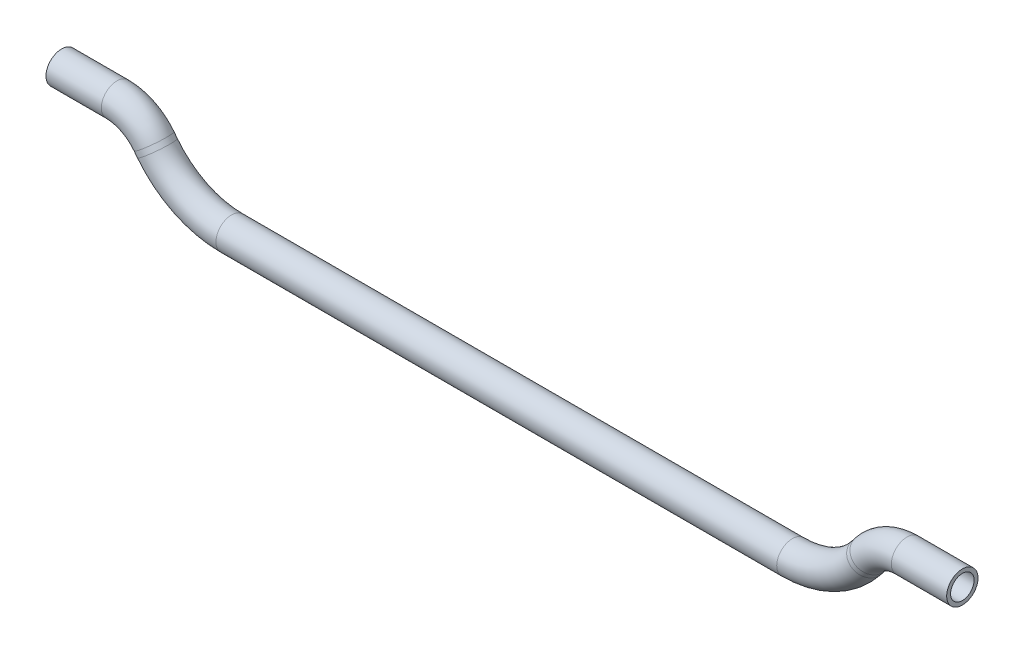
ISO-10303-21;
HEADER;
FILE_DESCRIPTION(('STEP AP214'),'2;1');
FILE_NAME('part.step','',(''),(''),'','','');
FILE_SCHEMA(('AUTOMOTIVE_DESIGN { 1 0 10303 214 1 1 1 1 }'));
ENDSEC;
DATA;
#1=APPLICATION_CONTEXT('core data for automotive mechanical design processes');
#2=APPLICATION_PROTOCOL_DEFINITION('international standard','automotive_design',2000,#1);
#3=PRODUCT_CONTEXT('',#1,'mechanical');
#4=PRODUCT('Part','Part','',(#3));
#5=PRODUCT_RELATED_PRODUCT_CATEGORY('part','',(#4));
#6=PRODUCT_DEFINITION_FORMATION('','',#4);
#7=PRODUCT_DEFINITION_CONTEXT('part definition',#1,'design');
#8=PRODUCT_DEFINITION('design','',#6,#7);
#9=PRODUCT_DEFINITION_SHAPE('','',#8);
#10=(LENGTH_UNIT() NAMED_UNIT(*) SI_UNIT(.MILLI.,.METRE.));
#11=(NAMED_UNIT(*) PLANE_ANGLE_UNIT() SI_UNIT($,.RADIAN.));
#12=(NAMED_UNIT(*) SI_UNIT($,.STERADIAN.) SOLID_ANGLE_UNIT());
#13=UNCERTAINTY_MEASURE_WITH_UNIT(LENGTH_MEASURE(1.E-05),#10,'distance_accuracy_value','');
#14=(GEOMETRIC_REPRESENTATION_CONTEXT(3) GLOBAL_UNCERTAINTY_ASSIGNED_CONTEXT((#13)) GLOBAL_UNIT_ASSIGNED_CONTEXT((#10,
#11,#12)) REPRESENTATION_CONTEXT('',''));
#15=CARTESIAN_POINT('',(0.,0.,0.));
#16=DIRECTION('',(0.,0.,1.));
#17=DIRECTION('',(1.,0.,0.));
#18=AXIS2_PLACEMENT_3D('',#15,#16,#17);
#19=CARTESIAN_POINT('',(1079.36394984699,1.11022302462516E-13,0.));
#20=DIRECTION('',(1.,0.,0.));
#21=DIRECTION('',(0.,1.,0.));
#22=AXIS2_PLACEMENT_3D('',#19,#20,#21);
#23=CYLINDRICAL_SURFACE('',#22,20.);
#24=CARTESIAN_POINT('',(1079.36394984699,1.11022302462516E-13,0.));
#25=DIRECTION('',(1.,0.,0.));
#26=DIRECTION('',(0.,0.,-1.));
#27=AXIS2_PLACEMENT_3D('',#24,#25,#26);
#28=CIRCLE('',#27,20.);
#29=CARTESIAN_POINT('',(1079.36394984699,20.0000000000001,0.));
#30=VERTEX_POINT('',#29);
#31=EDGE_CURVE('E43',#30,#30,#28,.T.);
#32=CARTESIAN_POINT('',(1150.,0.,0.));
#33=DIRECTION('',(1.,0.,0.));
#34=DIRECTION('',(0.,0.,-1.));
#35=AXIS2_PLACEMENT_3D('',#32,#33,#34);
#36=CIRCLE('',#35,20.);
#37=CARTESIAN_POINT('',(1150.,20.0000000000001,0.));
#38=VERTEX_POINT('',#37);
#39=EDGE_CURVE('E10',#38,#38,#36,.T.);
#40=CARTESIAN_POINT('',(1079.36394984699,20.0000000000001,0.));
#41=CARTESIAN_POINT('',(1080.09974203608,20.0000000000001,0.));
#42=CARTESIAN_POINT('',(1080.83553422518,20.0000000000001,0.));
#43=CARTESIAN_POINT('',(1082.30711860336,20.0000000000001,0.));
#44=CARTESIAN_POINT('',(1083.04291079246,20.0000000000001,0.));
#45=CARTESIAN_POINT('',(1084.51449517065,20.0000000000001,0.));
#46=CARTESIAN_POINT('',(1085.25028735974,20.0000000000001,0.));
#47=CARTESIAN_POINT('',(1086.72187173793,20.0000000000001,0.));
#48=CARTESIAN_POINT('',(1087.45766392702,20.0000000000001,0.));
#49=CARTESIAN_POINT('',(1088.92924830521,20.0000000000001,0.));
#50=CARTESIAN_POINT('',(1089.6650404943,20.0000000000001,0.));
#51=CARTESIAN_POINT('',(1091.13662487249,20.0000000000001,0.));
#52=CARTESIAN_POINT('',(1091.87241706158,20.0000000000001,0.));
#53=CARTESIAN_POINT('',(1093.34400143977,20.0000000000001,0.));
#54=CARTESIAN_POINT('',(1094.07979362887,20.0000000000001,0.));
#55=CARTESIAN_POINT('',(1095.55137800705,20.0000000000001,0.));
#56=CARTESIAN_POINT('',(1096.28717019615,20.0000000000001,0.));
#57=CARTESIAN_POINT('',(1097.75875457433,20.0000000000001,0.));
#58=CARTESIAN_POINT('',(1098.49454676343,20.0000000000001,0.));
#59=CARTESIAN_POINT('',(1099.96613114162,20.0000000000001,0.));
#60=CARTESIAN_POINT('',(1100.70192333071,20.0000000000001,0.));
#61=CARTESIAN_POINT('',(1102.1735077089,20.0000000000001,0.));
#62=CARTESIAN_POINT('',(1102.90929989799,20.0000000000001,0.));
#63=CARTESIAN_POINT('',(1104.38088427618,20.0000000000001,0.));
#64=CARTESIAN_POINT('',(1105.11667646527,20.0000000000001,0.));
#65=CARTESIAN_POINT('',(1106.58826084346,20.0000000000001,0.));
#66=CARTESIAN_POINT('',(1107.32405303256,20.0000000000001,0.));
#67=CARTESIAN_POINT('',(1108.79563741074,20.0000000000001,0.));
#68=CARTESIAN_POINT('',(1109.53142959984,20.0000000000001,0.));
#69=CARTESIAN_POINT('',(1111.00301397802,20.0000000000001,0.));
#70=CARTESIAN_POINT('',(1111.73880616712,20.0000000000001,0.));
#71=CARTESIAN_POINT('',(1113.21039054531,20.0000000000001,0.));
#72=CARTESIAN_POINT('',(1113.9461827344,20.0000000000001,0.));
#73=CARTESIAN_POINT('',(1115.41776711259,20.0000000000001,0.));
#74=CARTESIAN_POINT('',(1116.15355930168,20.0000000000001,0.));
#75=CARTESIAN_POINT('',(1117.62514367987,20.0000000000001,0.));
#76=CARTESIAN_POINT('',(1118.36093586896,20.0000000000001,0.));
#77=CARTESIAN_POINT('',(1119.83252024715,20.0000000000001,0.));
#78=CARTESIAN_POINT('',(1120.56831243625,20.0000000000001,0.));
#79=CARTESIAN_POINT('',(1122.03989681443,20.0000000000001,0.));
#80=CARTESIAN_POINT('',(1122.77568900353,20.0000000000001,0.));
#81=CARTESIAN_POINT('',(1124.24727338171,20.0000000000001,0.));
#82=CARTESIAN_POINT('',(1124.98306557081,20.0000000000001,0.));
#83=CARTESIAN_POINT('',(1126.454649949,20.0000000000001,0.));
#84=CARTESIAN_POINT('',(1127.19044213809,20.0000000000001,0.));
#85=CARTESIAN_POINT('',(1128.66202651628,20.0000000000001,0.));
#86=CARTESIAN_POINT('',(1129.39781870537,20.0000000000001,0.));
#87=CARTESIAN_POINT('',(1130.86940308356,20.0000000000001,0.));
#88=CARTESIAN_POINT('',(1131.60519527265,20.0000000000001,0.));
#89=CARTESIAN_POINT('',(1133.07677965084,20.0000000000001,0.));
#90=CARTESIAN_POINT('',(1133.81257183993,20.0000000000001,0.));
#91=CARTESIAN_POINT('',(1135.28415621812,20.0000000000001,0.));
#92=CARTESIAN_POINT('',(1136.01994840722,20.0000000000001,0.));
#93=CARTESIAN_POINT('',(1137.4915327854,20.0000000000001,0.));
#94=CARTESIAN_POINT('',(1138.2273249745,20.0000000000001,0.));
#95=CARTESIAN_POINT('',(1139.69890935269,20.0000000000001,0.));
#96=CARTESIAN_POINT('',(1140.43470154178,20.0000000000001,0.));
#97=CARTESIAN_POINT('',(1141.90628591997,20.0000000000001,0.));
#98=CARTESIAN_POINT('',(1142.64207810906,20.0000000000001,0.));
#99=CARTESIAN_POINT('',(1144.11366248725,20.0000000000001,0.));
#100=CARTESIAN_POINT('',(1144.84945467634,20.0000000000001,0.));
#101=CARTESIAN_POINT('',(1146.32103905453,20.0000000000001,0.));
#102=CARTESIAN_POINT('',(1147.05683124362,20.0000000000001,0.));
#103=CARTESIAN_POINT('',(1148.52841562181,20.0000000000001,0.));
#104=CARTESIAN_POINT('',(1149.26420781091,20.0000000000001,0.));
#105=CARTESIAN_POINT('',(1150.,20.0000000000001,0.));
#106=B_SPLINE_CURVE_WITH_KNOTS('',3,(#40,#41,#42,#43,#44,#45,#46,#47,#48,#49,#50,#51,#52,#53,
#54,#55,#56,#57,#58,#59,#60,#61,#62,#63,#64,#65,#66,#67,#68,#69,#70,#71,#72,#73,#74,#75,#76,#77,
#78,#79,#80,#81,#82,#83,#84,#85,#86,#87,#88,#89,#90,#91,#92,#93,#94,#95,#96,#97,#98,#99,#100,
#101,#102,#103,#104,#105),.UNSPECIFIED.,.F.,.F.,(4,2,2,2,2,2,2,2,2,2,2,2,2,2,2,2,2,2,2,2,2,2,2,
2,2,2,2,2,2,2,2,2,4),(0.,2.20737656728143,4.41475313456308,6.62212970184473,8.82950626912637,
11.036882836408,13.2442594036897,15.4516359709713,17.659012538253,19.8663891055344,
22.073765672816,24.2811422400977,26.4885188073793,28.695895374661,30.9032719419426,
33.1106485092243,35.3180250765059,37.5254016437874,39.732778211069,41.9401547783507,
44.1475313456323,46.354907912914,48.5622844801956,50.7696610474773,52.9770376147589,
55.1844141820403,57.391790749322,59.5991673166036,61.8065438838853,64.0139204511669,
66.2212970184486,68.4286735857302,70.6360501530119),.UNSPECIFIED.);
#107=EDGE_CURVE('BSEAM33',#30,#38,#106,.T.);
#108=ORIENTED_EDGE('',*,*,#31,.T.);
#109=ORIENTED_EDGE('',*,*,#39,.F.);
#110=ORIENTED_EDGE('',*,*,#107,.T.);
#111=ORIENTED_EDGE('',*,*,#107,.F.);
#112=EDGE_LOOP('',(#108,#110,#109,#111));
#113=FACE_BOUND('',#112,.T.);
#114=ADVANCED_FACE('F33',(#113),#23,.T.);
#115=CARTESIAN_POINT('',(1079.36394984699,1.11022302462516E-13,0.));
#116=DIRECTION('',(1.,0.,0.));
#117=DIRECTION('',(0.,1.,0.));
#118=AXIS2_PLACEMENT_3D('',#115,#116,#117);
#119=CYLINDRICAL_SURFACE('',#118,15.);
#120=CARTESIAN_POINT('',(1079.36394984699,1.11022302462516E-13,0.));
#121=DIRECTION('',(1.,0.,0.));
#122=DIRECTION('',(0.,0.,-1.));
#123=AXIS2_PLACEMENT_3D('',#120,#121,#122);
#124=CIRCLE('',#123,15.);
#125=CARTESIAN_POINT('',(1079.36394984699,15.0000000000001,0.));
#126=VERTEX_POINT('',#125);
#127=EDGE_CURVE('E47',#126,#126,#124,.T.);
#128=CARTESIAN_POINT('',(1150.,0.,0.));
#129=DIRECTION('',(1.,0.,0.));
#130=DIRECTION('',(0.,0.,-1.));
#131=AXIS2_PLACEMENT_3D('',#128,#129,#130);
#132=CIRCLE('',#131,15.);
#133=CARTESIAN_POINT('',(1150.,15.0000000000001,0.));
#134=VERTEX_POINT('',#133);
#135=EDGE_CURVE('E39',#134,#134,#132,.T.);
#136=CARTESIAN_POINT('',(1079.36394984699,15.0000000000001,0.));
#137=CARTESIAN_POINT('',(1080.09974203608,15.0000000000001,0.));
#138=CARTESIAN_POINT('',(1080.83553422518,15.0000000000001,0.));
#139=CARTESIAN_POINT('',(1082.30711860336,15.0000000000001,0.));
#140=CARTESIAN_POINT('',(1083.04291079246,15.0000000000001,0.));
#141=CARTESIAN_POINT('',(1084.51449517065,15.0000000000001,0.));
#142=CARTESIAN_POINT('',(1085.25028735974,15.0000000000001,0.));
#143=CARTESIAN_POINT('',(1086.72187173793,15.0000000000001,0.));
#144=CARTESIAN_POINT('',(1087.45766392702,15.0000000000001,0.));
#145=CARTESIAN_POINT('',(1088.92924830521,15.0000000000001,0.));
#146=CARTESIAN_POINT('',(1089.6650404943,15.0000000000001,0.));
#147=CARTESIAN_POINT('',(1091.13662487249,15.0000000000001,0.));
#148=CARTESIAN_POINT('',(1091.87241706158,15.0000000000001,0.));
#149=CARTESIAN_POINT('',(1093.34400143977,15.0000000000001,0.));
#150=CARTESIAN_POINT('',(1094.07979362887,15.0000000000001,0.));
#151=CARTESIAN_POINT('',(1095.55137800705,15.0000000000001,0.));
#152=CARTESIAN_POINT('',(1096.28717019615,15.0000000000001,0.));
#153=CARTESIAN_POINT('',(1097.75875457433,15.0000000000001,0.));
#154=CARTESIAN_POINT('',(1098.49454676343,15.0000000000001,0.));
#155=CARTESIAN_POINT('',(1099.96613114162,15.0000000000001,0.));
#156=CARTESIAN_POINT('',(1100.70192333071,15.0000000000001,0.));
#157=CARTESIAN_POINT('',(1102.1735077089,15.0000000000001,0.));
#158=CARTESIAN_POINT('',(1102.90929989799,15.0000000000001,0.));
#159=CARTESIAN_POINT('',(1104.38088427618,15.0000000000001,0.));
#160=CARTESIAN_POINT('',(1105.11667646527,15.0000000000001,0.));
#161=CARTESIAN_POINT('',(1106.58826084346,15.0000000000001,0.));
#162=CARTESIAN_POINT('',(1107.32405303256,15.0000000000001,0.));
#163=CARTESIAN_POINT('',(1108.79563741074,15.0000000000001,0.));
#164=CARTESIAN_POINT('',(1109.53142959984,15.0000000000001,0.));
#165=CARTESIAN_POINT('',(1111.00301397802,15.0000000000001,0.));
#166=CARTESIAN_POINT('',(1111.73880616712,15.0000000000001,0.));
#167=CARTESIAN_POINT('',(1113.21039054531,15.0000000000001,0.));
#168=CARTESIAN_POINT('',(1113.9461827344,15.0000000000001,0.));
#169=CARTESIAN_POINT('',(1115.41776711259,15.0000000000001,0.));
#170=CARTESIAN_POINT('',(1116.15355930168,15.0000000000001,0.));
#171=CARTESIAN_POINT('',(1117.62514367987,15.0000000000001,0.));
#172=CARTESIAN_POINT('',(1118.36093586896,15.0000000000001,0.));
#173=CARTESIAN_POINT('',(1119.83252024715,15.0000000000001,0.));
#174=CARTESIAN_POINT('',(1120.56831243625,15.0000000000001,0.));
#175=CARTESIAN_POINT('',(1122.03989681443,15.0000000000001,0.));
#176=CARTESIAN_POINT('',(1122.77568900353,15.0000000000001,0.));
#177=CARTESIAN_POINT('',(1124.24727338171,15.0000000000001,0.));
#178=CARTESIAN_POINT('',(1124.98306557081,15.0000000000001,0.));
#179=CARTESIAN_POINT('',(1126.454649949,15.0000000000001,0.));
#180=CARTESIAN_POINT('',(1127.19044213809,15.0000000000001,0.));
#181=CARTESIAN_POINT('',(1128.66202651628,15.0000000000001,0.));
#182=CARTESIAN_POINT('',(1129.39781870537,15.0000000000001,0.));
#183=CARTESIAN_POINT('',(1130.86940308356,15.0000000000001,0.));
#184=CARTESIAN_POINT('',(1131.60519527265,15.0000000000001,0.));
#185=CARTESIAN_POINT('',(1133.07677965084,15.0000000000001,0.));
#186=CARTESIAN_POINT('',(1133.81257183993,15.0000000000001,0.));
#187=CARTESIAN_POINT('',(1135.28415621812,15.0000000000001,0.));
#188=CARTESIAN_POINT('',(1136.01994840722,15.0000000000001,0.));
#189=CARTESIAN_POINT('',(1137.4915327854,15.0000000000001,0.));
#190=CARTESIAN_POINT('',(1138.2273249745,15.0000000000001,0.));
#191=CARTESIAN_POINT('',(1139.69890935269,15.0000000000001,0.));
#192=CARTESIAN_POINT('',(1140.43470154178,15.0000000000001,0.));
#193=CARTESIAN_POINT('',(1141.90628591997,15.0000000000001,0.));
#194=CARTESIAN_POINT('',(1142.64207810906,15.0000000000001,0.));
#195=CARTESIAN_POINT('',(1144.11366248725,15.0000000000001,0.));
#196=CARTESIAN_POINT('',(1144.84945467634,15.0000000000001,0.));
#197=CARTESIAN_POINT('',(1146.32103905453,15.0000000000001,0.));
#198=CARTESIAN_POINT('',(1147.05683124362,15.0000000000001,0.));
#199=CARTESIAN_POINT('',(1148.52841562181,15.0000000000001,0.));
#200=CARTESIAN_POINT('',(1149.26420781091,15.0000000000001,0.));
#201=CARTESIAN_POINT('',(1150.,15.0000000000001,0.));
#202=B_SPLINE_CURVE_WITH_KNOTS('',3,(#136,#137,#138,#139,#140,#141,#142,#143,#144,#145,#146,
#147,#148,#149,#150,#151,#152,#153,#154,#155,#156,#157,#158,#159,#160,#161,#162,#163,#164,#165,
#166,#167,#168,#169,#170,#171,#172,#173,#174,#175,#176,#177,#178,#179,#180,#181,#182,#183,#184,
#185,#186,#187,#188,#189,#190,#191,#192,#193,#194,#195,#196,#197,#198,#199,#200,#201),
.UNSPECIFIED.,.F.,.F.,(4,2,2,2,2,2,2,2,2,2,2,2,2,2,2,2,2,2,2,2,2,2,2,2,2,2,2,2,2,2,2,2,4),(0.,
2.20737656728165,4.4147531345633,6.62212970184495,8.8295062691266,11.0368828364082,
13.2442594036899,15.4516359709715,17.6590125382532,19.8663891055346,22.0737656728163,
24.2811422400979,26.4885188073796,28.6958953746612,30.9032719419429,33.1106485092245,
35.3180250765062,37.5254016437876,39.7327782110692,41.9401547783509,44.1475313456325,
46.3549079129142,48.5622844801958,50.7696610474775,52.9770376147591,55.1844141820406,
57.3917907493222,59.5991673166039,61.8065438838855,64.0139204511672,66.2212970184488,
68.4286735857305,70.6360501530121),.UNSPECIFIED.);
#203=EDGE_CURVE('BSEAM153',#126,#134,#202,.T.);
#204=ORIENTED_EDGE('',*,*,#127,.F.);
#205=ORIENTED_EDGE('',*,*,#135,.T.);
#206=ORIENTED_EDGE('',*,*,#203,.T.);
#207=ORIENTED_EDGE('',*,*,#203,.F.);
#208=EDGE_LOOP('',(#204,#206,#205,#207));
#209=FACE_BOUND('',#208,.T.);
#210=ADVANCED_FACE('F153',(#209),#119,.F.);
#211=CARTESIAN_POINT('',(1079.36394984699,-60.,0.));
#212=DIRECTION('',(0.,0.,-1.));
#213=DIRECTION('',(-1.,0.,0.));
#214=AXIS2_PLACEMENT_3D('',#211,#212,#213);
#215=TOROIDAL_SURFACE('',#214,60.0000000000001,20.);
#216=CARTESIAN_POINT('',(1031.9840766375,-23.1876703446674,0.));
#217=DIRECTION('',(0.613538827588876,0.78966455349146,0.));
#218=DIRECTION('',(0.,0.,-1.));
#219=AXIS2_PLACEMENT_3D('',#216,#217,#218);
#220=CIRCLE('',#219,20.);
#221=CARTESIAN_POINT('',(1016.19078556767,-10.9168937928899,0.));
#222=VERTEX_POINT('',#221);
#223=EDGE_CURVE('E52',#222,#222,#220,.T.);
#224=CARTESIAN_POINT('',(1079.36394984699,-60.,0.));
#225=DIRECTION('',(0.,0.,-1.));
#226=DIRECTION('',(-1.,0.,0.));
#227=AXIS2_PLACEMENT_3D('',#224,#225,#226);
#228=CIRCLE('',#227,80.0000000000001);
#229=EDGE_CURVE('',#222,#30,#228,.T.);
#230=ORIENTED_EDGE('',*,*,#223,.T.);
#231=ORIENTED_EDGE('',*,*,#31,.F.);
#232=ORIENTED_EDGE('',*,*,#229,.T.);
#233=ORIENTED_EDGE('',*,*,#229,.F.);
#234=EDGE_LOOP('',(#230,#232,#231,#233));
#235=FACE_BOUND('',#234,.T.);
#236=ADVANCED_FACE('F149',(#235),#215,.T.);
#237=CARTESIAN_POINT('',(1079.36394984699,-60.,0.));
#238=DIRECTION('',(0.,0.,-1.));
#239=DIRECTION('',(-1.,0.,0.));
#240=AXIS2_PLACEMENT_3D('',#237,#238,#239);
#241=TOROIDAL_SURFACE('',#240,60.0000000000001,15.);
#242=CARTESIAN_POINT('',(1031.9840766375,-23.1876703446674,0.));
#243=DIRECTION('',(0.613538827588876,0.78966455349146,0.));
#244=DIRECTION('',(0.,0.,-1.));
#245=AXIS2_PLACEMENT_3D('',#242,#243,#244);
#246=CIRCLE('',#245,15.);
#247=CARTESIAN_POINT('',(1020.13910833513,-13.9845879308342,0.));
#248=VERTEX_POINT('',#247);
#249=EDGE_CURVE('E55',#248,#248,#246,.T.);
#250=CARTESIAN_POINT('',(1079.36394984699,-60.,0.));
#251=DIRECTION('',(0.,0.,-1.));
#252=DIRECTION('',(-1.,0.,0.));
#253=AXIS2_PLACEMENT_3D('',#250,#251,#252);
#254=CIRCLE('',#253,75.0000000000001);
#255=EDGE_CURVE('',#248,#126,#254,.T.);
#256=ORIENTED_EDGE('',*,*,#249,.F.);
#257=ORIENTED_EDGE('',*,*,#127,.T.);
#258=ORIENTED_EDGE('',*,*,#255,.T.);
#259=ORIENTED_EDGE('',*,*,#255,.F.);
#260=EDGE_LOOP('',(#256,#258,#257,#259));
#261=FACE_BOUND('',#260,.T.);
#262=ADVANCED_FACE('F146',(#261),#241,.F.);
#263=CARTESIAN_POINT('',(1027.75974641898,-28.6246593106653,0.));
#264=DIRECTION('',(0.613538827588877,0.78966455349146,0.));
#265=DIRECTION('',(-0.78966455349146,0.613538827588877,0.));
#266=AXIS2_PLACEMENT_3D('',#263,#264,#265);
#267=CYLINDRICAL_SURFACE('',#266,20.);
#268=CARTESIAN_POINT('',(1027.75974641898,-28.6246593106653,0.));
#269=DIRECTION('',(0.613538827588876,0.78966455349146,0.));
#270=DIRECTION('',(0.,0.,-1.));
#271=AXIS2_PLACEMENT_3D('',#268,#269,#270);
#272=CIRCLE('',#271,20.);
#273=CARTESIAN_POINT('',(1043.5530374888,-40.8954358624428,0.));
#274=VERTEX_POINT('',#273);
#275=EDGE_CURVE('E58',#274,#274,#272,.T.);
#276=ORIENTED_EDGE('',*,*,#275,.T.);
#277=EDGE_LOOP('',(#276));
#278=FACE_BOUND('',#277,.T.);
#279=ORIENTED_EDGE('',*,*,#223,.F.);
#280=EDGE_LOOP('',(#279));
#281=FACE_BOUND('',#280,.T.);
#282=ADVANCED_FACE('F142',(#278,#281),#267,.T.);
#283=CARTESIAN_POINT('',(1027.75974641898,-28.6246593106653,0.));
#284=DIRECTION('',(0.613538827588877,0.78966455349146,0.));
#285=DIRECTION('',(-0.78966455349146,0.613538827588877,0.));
#286=AXIS2_PLACEMENT_3D('',#283,#284,#285);
#287=CYLINDRICAL_SURFACE('',#286,15.);
#288=CARTESIAN_POINT('',(1027.75974641898,-28.6246593106653,0.));
#289=DIRECTION('',(0.613538827588876,0.78966455349146,0.));
#290=DIRECTION('',(0.,0.,-1.));
#291=AXIS2_PLACEMENT_3D('',#288,#289,#290);
#292=CIRCLE('',#291,15.);
#293=CARTESIAN_POINT('',(1039.60471472135,-37.8277417244984,0.));
#294=VERTEX_POINT('',#293);
#295=EDGE_CURVE('E61',#294,#294,#292,.T.);
#296=ORIENTED_EDGE('',*,*,#295,.F.);
#297=EDGE_LOOP('',(#296));
#298=FACE_BOUND('',#297,.T.);
#299=ORIENTED_EDGE('',*,*,#249,.T.);
#300=EDGE_LOOP('',(#299));
#301=FACE_BOUND('',#300,.T.);
#302=ADVANCED_FACE('F139',(#298,#301),#287,.F.);
#303=CARTESIAN_POINT('',(933.,45.,0.));
#304=DIRECTION('',(0.,0.,1.));
#305=DIRECTION('',(1.,0.,0.));
#306=AXIS2_PLACEMENT_3D('',#303,#304,#305);
#307=TOROIDAL_SURFACE('',#306,120.,20.);
#308=CARTESIAN_POINT('',(933.,-75.,0.));
#309=DIRECTION('',(1.,0.,0.));
#310=DIRECTION('',(0.,0.,-1.));
#311=AXIS2_PLACEMENT_3D('',#308,#309,#310);
#312=CIRCLE('',#311,20.);
#313=CARTESIAN_POINT('',(933.,-95.,0.));
#314=VERTEX_POINT('',#313);
#315=EDGE_CURVE('E64',#314,#314,#312,.T.);
#316=CARTESIAN_POINT('',(933.,45.,0.));
#317=DIRECTION('',(0.,0.,1.));
#318=DIRECTION('',(1.,0.,0.));
#319=AXIS2_PLACEMENT_3D('',#316,#317,#318);
#320=CIRCLE('',#319,140.);
#321=EDGE_CURVE('',#314,#274,#320,.T.);
#322=ORIENTED_EDGE('',*,*,#315,.T.);
#323=ORIENTED_EDGE('',*,*,#275,.F.);
#324=ORIENTED_EDGE('',*,*,#321,.T.);
#325=ORIENTED_EDGE('',*,*,#321,.F.);
#326=EDGE_LOOP('',(#322,#324,#323,#325));
#327=FACE_BOUND('',#326,.T.);
#328=ADVANCED_FACE('F135',(#327),#307,.T.);
#329=CARTESIAN_POINT('',(933.,45.,0.));
#330=DIRECTION('',(0.,0.,1.));
#331=DIRECTION('',(1.,0.,0.));
#332=AXIS2_PLACEMENT_3D('',#329,#330,#331);
#333=TOROIDAL_SURFACE('',#332,120.,15.);
#334=CARTESIAN_POINT('',(933.,-75.,0.));
#335=DIRECTION('',(1.,0.,0.));
#336=DIRECTION('',(0.,0.,-1.));
#337=AXIS2_PLACEMENT_3D('',#334,#335,#336);
#338=CIRCLE('',#337,15.);
#339=CARTESIAN_POINT('',(933.,-90.,0.));
#340=VERTEX_POINT('',#339);
#341=EDGE_CURVE('E67',#340,#340,#338,.T.);
#342=CARTESIAN_POINT('',(933.,45.,0.));
#343=DIRECTION('',(0.,0.,1.));
#344=DIRECTION('',(1.,0.,0.));
#345=AXIS2_PLACEMENT_3D('',#342,#343,#344);
#346=CIRCLE('',#345,135.);
#347=EDGE_CURVE('',#340,#294,#346,.T.);
#348=ORIENTED_EDGE('',*,*,#341,.F.);
#349=ORIENTED_EDGE('',*,*,#295,.T.);
#350=ORIENTED_EDGE('',*,*,#347,.T.);
#351=ORIENTED_EDGE('',*,*,#347,.F.);
#352=EDGE_LOOP('',(#348,#350,#349,#351));
#353=FACE_BOUND('',#352,.T.);
#354=ADVANCED_FACE('F132',(#353),#333,.F.);
#355=CARTESIAN_POINT('',(217.,-75.0000000000001,0.));
#356=DIRECTION('',(1.,0.,0.));
#357=DIRECTION('',(0.,1.,0.));
#358=AXIS2_PLACEMENT_3D('',#355,#356,#357);
#359=CYLINDRICAL_SURFACE('',#358,20.);
#360=CARTESIAN_POINT('',(217.,-75.0000000000001,0.));
#361=DIRECTION('',(1.,0.,0.));
#362=DIRECTION('',(0.,0.,-1.));
#363=AXIS2_PLACEMENT_3D('',#360,#361,#362);
#364=CIRCLE('',#363,20.);
#365=CARTESIAN_POINT('',(217.,-95.0000000000001,0.));
#366=VERTEX_POINT('',#365);
#367=EDGE_CURVE('E70',#366,#366,#364,.T.);
#368=ORIENTED_EDGE('',*,*,#367,.T.);
#369=EDGE_LOOP('',(#368));
#370=FACE_BOUND('',#369,.T.);
#371=ORIENTED_EDGE('',*,*,#315,.F.);
#372=EDGE_LOOP('',(#371));
#373=FACE_BOUND('',#372,.T.);
#374=ADVANCED_FACE('F128',(#370,#373),#359,.T.);
#375=CARTESIAN_POINT('',(217.,-75.0000000000001,0.));
#376=DIRECTION('',(1.,0.,0.));
#377=DIRECTION('',(0.,1.,0.));
#378=AXIS2_PLACEMENT_3D('',#375,#376,#377);
#379=CYLINDRICAL_SURFACE('',#378,15.);
#380=CARTESIAN_POINT('',(217.,-75.0000000000001,0.));
#381=DIRECTION('',(1.,0.,0.));
#382=DIRECTION('',(0.,0.,-1.));
#383=AXIS2_PLACEMENT_3D('',#380,#381,#382);
#384=CIRCLE('',#383,15.);
#385=CARTESIAN_POINT('',(217.,-90.0000000000001,0.));
#386=VERTEX_POINT('',#385);
#387=EDGE_CURVE('E73',#386,#386,#384,.T.);
#388=ORIENTED_EDGE('',*,*,#387,.F.);
#389=EDGE_LOOP('',(#388));
#390=FACE_BOUND('',#389,.T.);
#391=ORIENTED_EDGE('',*,*,#341,.T.);
#392=EDGE_LOOP('',(#391));
#393=FACE_BOUND('',#392,.T.);
#394=ADVANCED_FACE('F125',(#390,#393),#379,.F.);
#395=CARTESIAN_POINT('',(217.,45.,0.));
#396=DIRECTION('',(0.,0.,1.));
#397=DIRECTION('',(1.,0.,0.));
#398=AXIS2_PLACEMENT_3D('',#395,#396,#397);
#399=TOROIDAL_SURFACE('',#398,120.,20.);
#400=CARTESIAN_POINT('',(122.240253581025,-28.6246593106653,0.));
#401=DIRECTION('',(0.613538827588877,-0.78966455349146,0.));
#402=DIRECTION('',(0.,0.,-1.));
#403=AXIS2_PLACEMENT_3D('',#400,#401,#402);
#404=CIRCLE('',#403,20.);
#405=CARTESIAN_POINT('',(106.446962511195,-40.8954358624428,0.));
#406=VERTEX_POINT('',#405);
#407=EDGE_CURVE('E76',#406,#406,#404,.T.);
#408=CARTESIAN_POINT('',(217.,45.,0.));
#409=DIRECTION('',(0.,0.,1.));
#410=DIRECTION('',(1.,0.,0.));
#411=AXIS2_PLACEMENT_3D('',#408,#409,#410);
#412=CIRCLE('',#411,140.);
#413=EDGE_CURVE('',#406,#366,#412,.T.);
#414=ORIENTED_EDGE('',*,*,#407,.T.);
#415=ORIENTED_EDGE('',*,*,#367,.F.);
#416=ORIENTED_EDGE('',*,*,#413,.T.);
#417=ORIENTED_EDGE('',*,*,#413,.F.);
#418=EDGE_LOOP('',(#414,#416,#415,#417));
#419=FACE_BOUND('',#418,.T.);
#420=ADVANCED_FACE('F121',(#419),#399,.T.);
#421=CARTESIAN_POINT('',(217.,45.,0.));
#422=DIRECTION('',(0.,0.,1.));
#423=DIRECTION('',(1.,0.,0.));
#424=AXIS2_PLACEMENT_3D('',#421,#422,#423);
#425=TOROIDAL_SURFACE('',#424,120.,15.);
#426=CARTESIAN_POINT('',(122.240253581025,-28.6246593106653,0.));
#427=DIRECTION('',(0.613538827588877,-0.78966455349146,0.));
#428=DIRECTION('',(0.,0.,-1.));
#429=AXIS2_PLACEMENT_3D('',#426,#427,#428);
#430=CIRCLE('',#429,15.);
#431=CARTESIAN_POINT('',(110.395285278653,-37.8277417244984,0.));
#432=VERTEX_POINT('',#431);
#433=EDGE_CURVE('E79',#432,#432,#430,.T.);
#434=CARTESIAN_POINT('',(217.,45.,0.));
#435=DIRECTION('',(0.,0.,1.));
#436=DIRECTION('',(1.,0.,0.));
#437=AXIS2_PLACEMENT_3D('',#434,#435,#436);
#438=CIRCLE('',#437,135.);
#439=EDGE_CURVE('',#432,#386,#438,.T.);
#440=ORIENTED_EDGE('',*,*,#433,.F.);
#441=ORIENTED_EDGE('',*,*,#387,.T.);
#442=ORIENTED_EDGE('',*,*,#439,.T.);
#443=ORIENTED_EDGE('',*,*,#439,.F.);
#444=EDGE_LOOP('',(#440,#442,#441,#443));
#445=FACE_BOUND('',#444,.T.);
#446=ADVANCED_FACE('F118',(#445),#425,.F.);
#447=CARTESIAN_POINT('',(118.0159233625,-23.1876703446674,0.));
#448=DIRECTION('',(0.613538827588873,-0.789664553491462,0.));
#449=DIRECTION('',(0.789664553491462,0.613538827588874,0.));
#450=AXIS2_PLACEMENT_3D('',#447,#448,#449);
#451=CYLINDRICAL_SURFACE('',#450,20.);
#452=CARTESIAN_POINT('',(118.0159233625,-23.1876703446674,0.));
#453=DIRECTION('',(0.613538827588877,-0.78966455349146,0.));
#454=DIRECTION('',(0.,0.,-1.));
#455=AXIS2_PLACEMENT_3D('',#452,#453,#454);
#456=CIRCLE('',#455,20.);
#457=CARTESIAN_POINT('',(133.809214432329,-10.9168937928899,0.));
#458=VERTEX_POINT('',#457);
#459=EDGE_CURVE('E82',#458,#458,#456,.T.);
#460=ORIENTED_EDGE('',*,*,#459,.T.);
#461=EDGE_LOOP('',(#460));
#462=FACE_BOUND('',#461,.T.);
#463=ORIENTED_EDGE('',*,*,#407,.F.);
#464=EDGE_LOOP('',(#463));
#465=FACE_BOUND('',#464,.T.);
#466=ADVANCED_FACE('F114',(#462,#465),#451,.T.);
#467=CARTESIAN_POINT('',(118.0159233625,-23.1876703446674,0.));
#468=DIRECTION('',(0.613538827588873,-0.789664553491462,0.));
#469=DIRECTION('',(0.789664553491462,0.613538827588874,0.));
#470=AXIS2_PLACEMENT_3D('',#467,#468,#469);
#471=CYLINDRICAL_SURFACE('',#470,15.);
#472=CARTESIAN_POINT('',(118.0159233625,-23.1876703446674,0.));
#473=DIRECTION('',(0.613538827588877,-0.78966455349146,0.));
#474=DIRECTION('',(0.,0.,-1.));
#475=AXIS2_PLACEMENT_3D('',#472,#473,#474);
#476=CIRCLE('',#475,15.);
#477=CARTESIAN_POINT('',(129.860891664871,-13.9845879308342,0.));
#478=VERTEX_POINT('',#477);
#479=EDGE_CURVE('E85',#478,#478,#476,.T.);
#480=ORIENTED_EDGE('',*,*,#479,.F.);
#481=EDGE_LOOP('',(#480));
#482=FACE_BOUND('',#481,.T.);
#483=ORIENTED_EDGE('',*,*,#433,.T.);
#484=EDGE_LOOP('',(#483));
#485=FACE_BOUND('',#484,.T.);
#486=ADVANCED_FACE('F111',(#482,#485),#471,.F.);
#487=CARTESIAN_POINT('',(70.636050153012,-60.,0.));
#488=DIRECTION('',(0.,0.,-1.));
#489=DIRECTION('',(-1.,0.,0.));
#490=AXIS2_PLACEMENT_3D('',#487,#488,#489);
#491=TOROIDAL_SURFACE('',#490,60.,20.);
#492=CARTESIAN_POINT('',(70.636050153012,0.,0.));
#493=DIRECTION('',(1.,0.,0.));
#494=DIRECTION('',(0.,0.,-1.));
#495=AXIS2_PLACEMENT_3D('',#492,#493,#494);
#496=CIRCLE('',#495,20.);
#497=CARTESIAN_POINT('',(70.636050153012,20.,0.));
#498=VERTEX_POINT('',#497);
#499=EDGE_CURVE('E88',#498,#498,#496,.T.);
#500=CARTESIAN_POINT('',(70.636050153012,-60.,0.));
#501=DIRECTION('',(0.,0.,-1.));
#502=DIRECTION('',(-1.,0.,0.));
#503=AXIS2_PLACEMENT_3D('',#500,#501,#502);
#504=CIRCLE('',#503,80.);
#505=EDGE_CURVE('',#498,#458,#504,.T.);
#506=ORIENTED_EDGE('',*,*,#499,.T.);
#507=ORIENTED_EDGE('',*,*,#459,.F.);
#508=ORIENTED_EDGE('',*,*,#505,.T.);
#509=ORIENTED_EDGE('',*,*,#505,.F.);
#510=EDGE_LOOP('',(#506,#508,#507,#509));
#511=FACE_BOUND('',#510,.T.);
#512=ADVANCED_FACE('F107',(#511),#491,.T.);
#513=CARTESIAN_POINT('',(70.636050153012,-60.,0.));
#514=DIRECTION('',(0.,0.,-1.));
#515=DIRECTION('',(-1.,0.,0.));
#516=AXIS2_PLACEMENT_3D('',#513,#514,#515);
#517=TOROIDAL_SURFACE('',#516,60.,15.);
#518=CARTESIAN_POINT('',(70.636050153012,0.,0.));
#519=DIRECTION('',(1.,0.,0.));
#520=DIRECTION('',(0.,0.,-1.));
#521=AXIS2_PLACEMENT_3D('',#518,#519,#520);
#522=CIRCLE('',#521,15.);
#523=CARTESIAN_POINT('',(70.636050153012,15.,0.));
#524=VERTEX_POINT('',#523);
#525=EDGE_CURVE('E92',#524,#524,#522,.T.);
#526=CARTESIAN_POINT('',(70.636050153012,-60.,0.));
#527=DIRECTION('',(0.,0.,-1.));
#528=DIRECTION('',(-1.,0.,0.));
#529=AXIS2_PLACEMENT_3D('',#526,#527,#528);
#530=CIRCLE('',#529,75.);
#531=EDGE_CURVE('',#524,#478,#530,.T.);
#532=ORIENTED_EDGE('',*,*,#525,.F.);
#533=ORIENTED_EDGE('',*,*,#479,.T.);
#534=ORIENTED_EDGE('',*,*,#531,.T.);
#535=ORIENTED_EDGE('',*,*,#531,.F.);
#536=EDGE_LOOP('',(#532,#534,#533,#535));
#537=FACE_BOUND('',#536,.T.);
#538=ADVANCED_FACE('F104',(#537),#517,.F.);
#539=CARTESIAN_POINT('',(70.636050153012,0.,0.));
#540=DIRECTION('',(-1.,0.,0.));
#541=DIRECTION('',(0.,0.,1.));
#542=AXIS2_PLACEMENT_3D('',#539,#540,#541);
#543=CYLINDRICAL_SURFACE('',#542,15.);
#544=ORIENTED_EDGE('',*,*,#525,.T.);
#545=EDGE_LOOP('',(#544));
#546=FACE_BOUND('',#545,.T.);
#547=CARTESIAN_POINT('',(0.,0.,0.));
#548=DIRECTION('',(1.,0.,0.));
#549=DIRECTION('',(0.,0.,-1.));
#550=AXIS2_PLACEMENT_3D('',#547,#548,#549);
#551=CIRCLE('',#550,15.);
#552=CARTESIAN_POINT('',(0.,0.,-15.));
#553=VERTEX_POINT('',#552);
#554=EDGE_CURVE('E93',#553,#553,#551,.T.);
#555=ORIENTED_EDGE('',*,*,#554,.F.);
#556=EDGE_LOOP('',(#555));
#557=FACE_BOUND('',#556,.T.);
#558=ADVANCED_FACE('F101',(#546,#557),#543,.F.);
#559=CARTESIAN_POINT('',(70.636050153012,0.,0.));
#560=DIRECTION('',(-1.,0.,0.));
#561=DIRECTION('',(0.,0.,1.));
#562=AXIS2_PLACEMENT_3D('',#559,#560,#561);
#563=CYLINDRICAL_SURFACE('',#562,20.);
#564=ORIENTED_EDGE('',*,*,#499,.F.);
#565=EDGE_LOOP('',(#564));
#566=FACE_BOUND('',#565,.T.);
#567=CARTESIAN_POINT('',(0.,0.,0.));
#568=DIRECTION('',(1.,0.,0.));
#569=DIRECTION('',(0.,0.,-1.));
#570=AXIS2_PLACEMENT_3D('',#567,#568,#569);
#571=CIRCLE('',#570,20.);
#572=CARTESIAN_POINT('',(0.,0.,-20.));
#573=VERTEX_POINT('',#572);
#574=EDGE_CURVE('E89',#573,#573,#571,.T.);
#575=ORIENTED_EDGE('',*,*,#574,.T.);
#576=EDGE_LOOP('',(#575));
#577=FACE_BOUND('',#576,.T.);
#578=ADVANCED_FACE('F183',(#566,#577),#563,.T.);
#579=CARTESIAN_POINT('',(1150.,0.,0.));
#580=DIRECTION('',(1.,0.,0.));
#581=DIRECTION('',(0.,0.,-1.));
#582=AXIS2_PLACEMENT_3D('',#579,#580,#581);
#583=PLANE('',#582);
#584=ORIENTED_EDGE('',*,*,#135,.F.);
#585=EDGE_LOOP('',(#584));
#586=FACE_BOUND('',#585,.T.);
#587=ORIENTED_EDGE('',*,*,#39,.T.);
#588=EDGE_LOOP('',(#587));
#589=FACE_BOUND('',#588,.T.);
#590=ADVANCED_FACE('F186',(#586,#589),#583,.T.);
#591=CARTESIAN_POINT('',(0.,0.,0.));
#592=DIRECTION('',(1.,0.,0.));
#593=DIRECTION('',(0.,0.,-1.));
#594=AXIS2_PLACEMENT_3D('',#591,#592,#593);
#595=PLANE('',#594);
#596=ORIENTED_EDGE('',*,*,#554,.T.);
#597=EDGE_LOOP('',(#596));
#598=FACE_BOUND('',#597,.T.);
#599=ORIENTED_EDGE('',*,*,#574,.F.);
#600=EDGE_LOOP('',(#599));
#601=FACE_BOUND('',#600,.T.);
#602=ADVANCED_FACE('F188',(#598,#601),#595,.F.);
#603=CLOSED_SHELL('',(#114,#210,#236,#262,#282,#302,#328,#354,#374,#394,#420,#446,#466,#486,
#512,#538,#558,#578,#590,#602));
#604=MANIFOLD_SOLID_BREP('B2',#603);
#605=ADVANCED_BREP_SHAPE_REPRESENTATION('',(#18,#604),#14);
#606=SHAPE_DEFINITION_REPRESENTATION(#9,#605);
ENDSEC;
END-ISO-10303-21;
